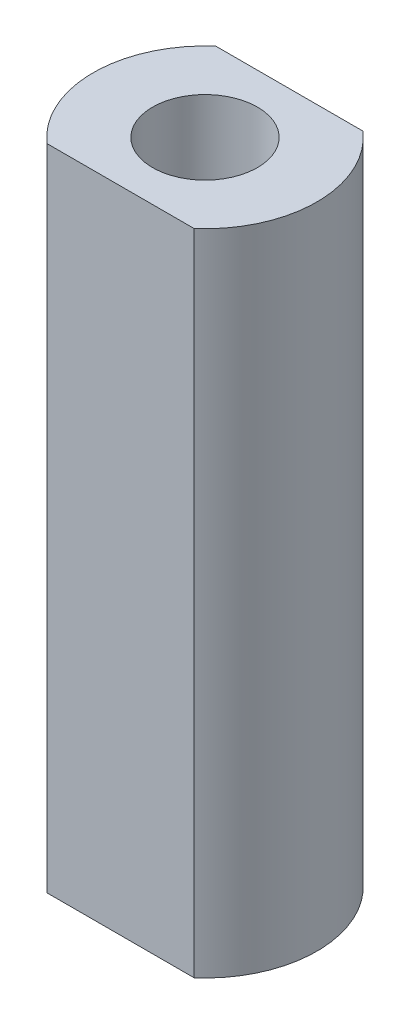
ISO-10303-21;
HEADER;
FILE_DESCRIPTION(('STEP AP214'),'2;1');
FILE_NAME('part.step','',(''),(''),'','','');
FILE_SCHEMA(('AUTOMOTIVE_DESIGN { 1 0 10303 214 1 1 1 1 }'));
ENDSEC;
DATA;
#1=APPLICATION_CONTEXT('core data for automotive mechanical design processes');
#2=APPLICATION_PROTOCOL_DEFINITION('international standard','automotive_design',2000,#1);
#3=PRODUCT_CONTEXT('',#1,'mechanical');
#4=PRODUCT('Part','Part','',(#3));
#5=PRODUCT_RELATED_PRODUCT_CATEGORY('part','',(#4));
#6=PRODUCT_DEFINITION_FORMATION('','',#4);
#7=PRODUCT_DEFINITION_CONTEXT('part definition',#1,'design');
#8=PRODUCT_DEFINITION('design','',#6,#7);
#9=PRODUCT_DEFINITION_SHAPE('','',#8);
#10=(LENGTH_UNIT() NAMED_UNIT(*) SI_UNIT(.MILLI.,.METRE.));
#11=(NAMED_UNIT(*) PLANE_ANGLE_UNIT() SI_UNIT($,.RADIAN.));
#12=(NAMED_UNIT(*) SI_UNIT($,.STERADIAN.) SOLID_ANGLE_UNIT());
#13=UNCERTAINTY_MEASURE_WITH_UNIT(LENGTH_MEASURE(1.E-05),#10,'distance_accuracy_value','');
#14=(GEOMETRIC_REPRESENTATION_CONTEXT(3) GLOBAL_UNCERTAINTY_ASSIGNED_CONTEXT((#13)) GLOBAL_UNIT_ASSIGNED_CONTEXT((#10,
#11,#12)) REPRESENTATION_CONTEXT('',''));
#15=CARTESIAN_POINT('',(0.,0.,0.));
#16=DIRECTION('',(0.,0.,1.));
#17=DIRECTION('',(1.,0.,0.));
#18=AXIS2_PLACEMENT_3D('',#15,#16,#17);
#19=CARTESIAN_POINT('',(-22.7898833777225,109.,15.6074334302218));
#20=DIRECTION('',(0.,0.,1.));
#21=DIRECTION('',(1.,0.,0.));
#22=AXIS2_PLACEMENT_3D('',#19,#20,#21);
#23=PLANE('',#22);
#24=DIRECTION('',(1.,0.,0.));
#25=VECTOR('',#24,1.);
#26=CARTESIAN_POINT('',(-22.7898833777225,120.,15.6074334302218));
#27=LINE('',#26,#25);
#28=CARTESIAN_POINT('',(-13.5977211958914,120.,15.6074334302218));
#29=VERTEX_POINT('',#28);
#30=CARTESIAN_POINT('',(13.5977211958914,120.,15.6074334302218));
#31=VERTEX_POINT('',#30);
#32=EDGE_CURVE('E87',#29,#31,#27,.T.);
#33=ORIENTED_EDGE('',*,*,#32,.F.);
#34=DIRECTION('',(0.,-1.,0.));
#35=VECTOR('',#34,1.);
#36=CARTESIAN_POINT('',(-13.5977211958914,109.5,15.6074334302218));
#37=LINE('',#36,#35);
#38=CARTESIAN_POINT('',(-13.5977211958914,0.,15.6074334302218));
#39=VERTEX_POINT('',#38);
#40=EDGE_CURVE('E60',#39,#29,#37,.F.);
#41=ORIENTED_EDGE('',*,*,#40,.F.);
#42=DIRECTION('',(-1.,0.,0.));
#43=VECTOR('',#42,1.);
#44=CARTESIAN_POINT('',(25.2749504481657,0.,15.6074334302218));
#45=LINE('',#44,#43);
#46=CARTESIAN_POINT('',(13.5977211958914,0.,15.6074334302218));
#47=VERTEX_POINT('',#46);
#48=EDGE_CURVE('E89',#47,#39,#45,.T.);
#49=ORIENTED_EDGE('',*,*,#48,.F.);
#50=DIRECTION('',(0.,-1.,0.));
#51=VECTOR('',#50,1.);
#52=CARTESIAN_POINT('',(13.5977211958914,109.5,15.6074334302218));
#53=LINE('',#52,#51);
#54=EDGE_CURVE('E85',#31,#47,#53,.T.);
#55=ORIENTED_EDGE('',*,*,#54,.F.);
#56=EDGE_LOOP('',(#33,#41,#49,#55));
#57=FACE_BOUND('',#56,.T.);
#58=ADVANCED_FACE('F45',(#57),#23,.T.);
#59=CARTESIAN_POINT('',(-22.7898833777225,109.,-15.6074334302218));
#60=DIRECTION('',(0.,0.,-1.));
#61=DIRECTION('',(-1.,0.,0.));
#62=AXIS2_PLACEMENT_3D('',#59,#60,#61);
#63=PLANE('',#62);
#64=DIRECTION('',(-1.,0.,0.));
#65=VECTOR('',#64,1.);
#66=CARTESIAN_POINT('',(-22.7898833777225,120.,-15.6074334302218));
#67=LINE('',#66,#65);
#68=CARTESIAN_POINT('',(13.5977211958914,120.,-15.6074334302218));
#69=VERTEX_POINT('',#68);
#70=CARTESIAN_POINT('',(-13.5977211958914,120.,-15.6074334302218));
#71=VERTEX_POINT('',#70);
#72=EDGE_CURVE('E100',#69,#71,#67,.T.);
#73=ORIENTED_EDGE('',*,*,#72,.F.);
#74=DIRECTION('',(0.,-1.,0.));
#75=VECTOR('',#74,1.);
#76=CARTESIAN_POINT('',(13.5977211958914,120.,-15.6074334302218));
#77=LINE('',#76,#75);
#78=CARTESIAN_POINT('',(13.5977211958914,109.5,-15.6074334302218));
#79=VERTEX_POINT('',#78);
#80=EDGE_CURVE('E66',#69,#79,#77,.T.);
#81=ORIENTED_EDGE('',*,*,#80,.T.);
#82=DIRECTION('',(-1.,0.,0.));
#83=VECTOR('',#82,1.);
#84=CARTESIAN_POINT('',(0.,109.5,-15.6074334302218));
#85=LINE('',#84,#83);
#86=CARTESIAN_POINT('',(-13.5977211958914,109.5,-15.6074334302218));
#87=VERTEX_POINT('',#86);
#88=EDGE_CURVE('E99',#79,#87,#85,.T.);
#89=ORIENTED_EDGE('',*,*,#88,.T.);
#90=DIRECTION('',(0.,-1.,0.));
#91=VECTOR('',#90,1.);
#92=CARTESIAN_POINT('',(-13.5977211958914,120.,-15.6074334302218));
#93=LINE('',#92,#91);
#94=EDGE_CURVE('E96',#87,#71,#93,.F.);
#95=ORIENTED_EDGE('',*,*,#94,.T.);
#96=EDGE_LOOP('',(#73,#81,#89,#95));
#97=FACE_BOUND('',#96,.T.);
#98=ADVANCED_FACE('F135',(#97),#63,.T.);
#99=CARTESIAN_POINT('',(0.,120.,0.));
#100=DIRECTION('',(0.,1.,0.));
#101=DIRECTION('',(0.,0.,1.));
#102=AXIS2_PLACEMENT_3D('',#99,#100,#101);
#103=PLANE('',#102);
#104=CARTESIAN_POINT('',(0.,120.,0.));
#105=DIRECTION('',(0.,-1.,0.));
#106=DIRECTION('',(0.,0.,-1.));
#107=AXIS2_PLACEMENT_3D('',#104,#105,#106);
#108=CIRCLE('',#107,9.7);
#109=CARTESIAN_POINT('',(0.,120.,-9.7));
#110=VERTEX_POINT('',#109);
#111=EDGE_CURVE('E105',#110,#110,#108,.T.);
#112=ORIENTED_EDGE('',*,*,#111,.T.);
#113=EDGE_LOOP('',(#112));
#114=FACE_BOUND('',#113,.T.);
#115=ORIENTED_EDGE('',*,*,#32,.T.);
#116=CARTESIAN_POINT('',(0.,120.,0.));
#117=DIRECTION('',(0.,-1.,0.));
#118=DIRECTION('',(0.,0.,-1.));
#119=AXIS2_PLACEMENT_3D('',#116,#117,#118);
#120=CIRCLE('',#119,20.7);
#121=EDGE_CURVE('E92',#69,#31,#120,.T.);
#122=ORIENTED_EDGE('',*,*,#121,.F.);
#123=ORIENTED_EDGE('',*,*,#72,.T.);
#124=CARTESIAN_POINT('',(0.,120.,0.));
#125=DIRECTION('',(0.,1.,0.));
#126=DIRECTION('',(0.,0.,1.));
#127=AXIS2_PLACEMENT_3D('',#124,#125,#126);
#128=CIRCLE('',#127,20.7);
#129=EDGE_CURVE('E12',#71,#29,#128,.T.);
#130=ORIENTED_EDGE('',*,*,#129,.T.);
#131=EDGE_LOOP('',(#115,#122,#123,#130));
#132=FACE_BOUND('',#131,.T.);
#133=ADVANCED_FACE('F98',(#114,#132),#103,.T.);
#134=CARTESIAN_POINT('',(0.,109.5,0.));
#135=DIRECTION('',(0.,-1.,0.));
#136=DIRECTION('',(0.,0.,-1.));
#137=AXIS2_PLACEMENT_3D('',#134,#135,#136);
#138=CYLINDRICAL_SURFACE('',#137,9.7);
#139=CARTESIAN_POINT('',(0.,0.,0.));
#140=DIRECTION('',(0.,1.,0.));
#141=DIRECTION('',(0.,0.,1.));
#142=AXIS2_PLACEMENT_3D('',#139,#140,#141);
#143=CIRCLE('',#142,9.7);
#144=CARTESIAN_POINT('',(0.,0.,9.7));
#145=VERTEX_POINT('',#144);
#146=EDGE_CURVE('E103',#145,#145,#143,.T.);
#147=ORIENTED_EDGE('',*,*,#146,.F.);
#148=EDGE_LOOP('',(#147));
#149=FACE_BOUND('',#148,.T.);
#150=ORIENTED_EDGE('',*,*,#111,.F.);
#151=EDGE_LOOP('',(#150));
#152=FACE_BOUND('',#151,.T.);
#153=ADVANCED_FACE('F124',(#149,#152),#138,.F.);
#154=CARTESIAN_POINT('',(0.,109.5,0.));
#155=DIRECTION('',(0.,1.,0.));
#156=DIRECTION('',(0.,0.,1.));
#157=AXIS2_PLACEMENT_3D('',#154,#155,#156);
#158=PLANE('',#157);
#159=ORIENTED_EDGE('',*,*,#88,.F.);
#160=CARTESIAN_POINT('',(0.,109.5,0.));
#161=DIRECTION('',(0.,1.,0.));
#162=DIRECTION('',(1.,0.,0.));
#163=AXIS2_PLACEMENT_3D('',#160,#161,#162);
#164=CIRCLE('',#163,20.7);
#165=EDGE_CURVE('E53',#79,#87,#164,.T.);
#166=ORIENTED_EDGE('',*,*,#165,.T.);
#167=EDGE_LOOP('',(#159,#166));
#168=FACE_BOUND('',#167,.T.);
#169=ADVANCED_FACE('F126',(#168),#158,.T.);
#170=CARTESIAN_POINT('',(0.,0.,0.));
#171=DIRECTION('',(0.,1.,0.));
#172=DIRECTION('',(0.,0.,1.));
#173=AXIS2_PLACEMENT_3D('',#170,#171,#172);
#174=PLANE('',#173);
#175=CARTESIAN_POINT('',(0.,0.,0.));
#176=DIRECTION('',(0.,1.,0.));
#177=DIRECTION('',(1.,0.,0.));
#178=AXIS2_PLACEMENT_3D('',#175,#176,#177);
#179=CIRCLE('',#178,20.7);
#180=EDGE_CURVE('E111',#47,#39,#179,.T.);
#181=ORIENTED_EDGE('',*,*,#180,.F.);
#182=ORIENTED_EDGE('',*,*,#48,.T.);
#183=EDGE_LOOP('',(#181,#182));
#184=FACE_BOUND('',#183,.T.);
#185=ORIENTED_EDGE('',*,*,#146,.T.);
#186=EDGE_LOOP('',(#185));
#187=FACE_BOUND('',#186,.T.);
#188=ADVANCED_FACE('F114',(#184,#187),#174,.F.);
#189=CARTESIAN_POINT('',(0.,109.5,0.));
#190=DIRECTION('',(0.,-1.,0.));
#191=DIRECTION('',(0.,0.,-1.));
#192=AXIS2_PLACEMENT_3D('',#189,#190,#191);
#193=CYLINDRICAL_SURFACE('',#192,20.7);
#194=ORIENTED_EDGE('',*,*,#94,.F.);
#195=ORIENTED_EDGE('',*,*,#165,.F.);
#196=ORIENTED_EDGE('',*,*,#80,.F.);
#197=ORIENTED_EDGE('',*,*,#121,.T.);
#198=ORIENTED_EDGE('',*,*,#54,.T.);
#199=ORIENTED_EDGE('',*,*,#180,.T.);
#200=ORIENTED_EDGE('',*,*,#40,.T.);
#201=ORIENTED_EDGE('',*,*,#129,.F.);
#202=EDGE_LOOP('',(#194,#195,#196,#197,#198,#199,#200,#201));
#203=FACE_BOUND('',#202,.T.);
#204=ADVANCED_FACE('F47',(#203),#193,.T.);
#205=CLOSED_SHELL('',(#58,#98,#133,#153,#169,#188,#204));
#206=MANIFOLD_SOLID_BREP('B2',#205);
#207=ADVANCED_BREP_SHAPE_REPRESENTATION('',(#18,#206),#14);
#208=SHAPE_DEFINITION_REPRESENTATION(#9,#207);
ENDSEC;
END-ISO-10303-21;
